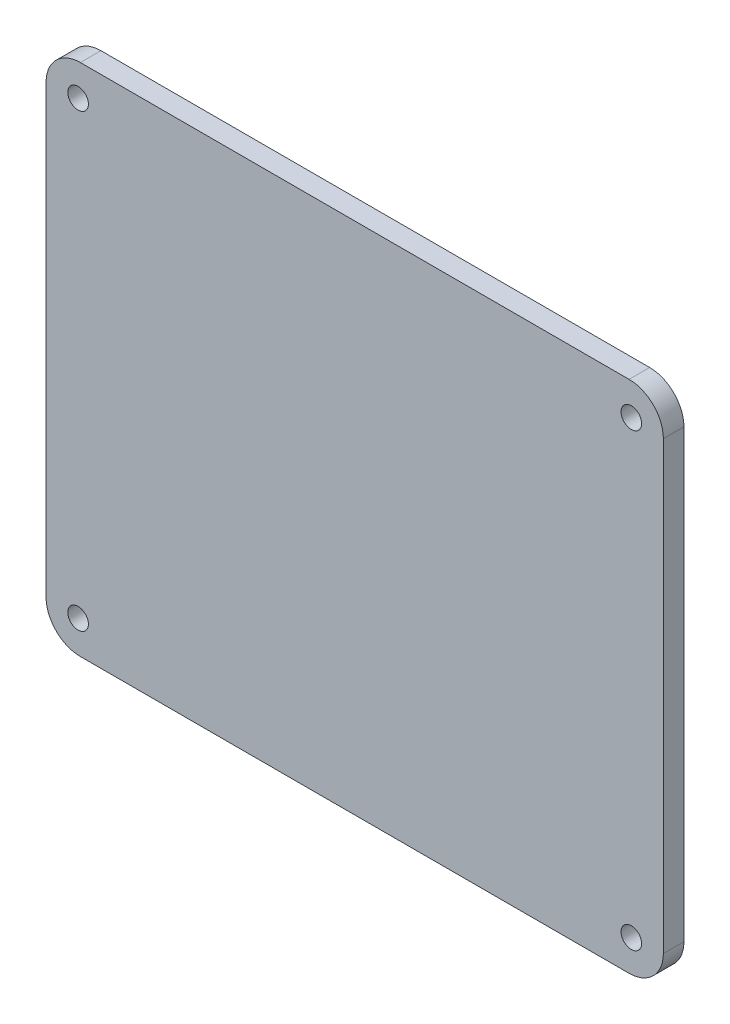
ISO-10303-21;
HEADER;
FILE_DESCRIPTION(('STEP AP214'),'2;1');
FILE_NAME('part.step','',(''),(''),'','','');
FILE_SCHEMA(('AUTOMOTIVE_DESIGN { 1 0 10303 214 1 1 1 1 }'));
ENDSEC;
DATA;
#1=APPLICATION_CONTEXT('core data for automotive mechanical design processes');
#2=APPLICATION_PROTOCOL_DEFINITION('international standard','automotive_design',2000,#1);
#3=PRODUCT_CONTEXT('',#1,'mechanical');
#4=PRODUCT('Part','Part','',(#3));
#5=PRODUCT_RELATED_PRODUCT_CATEGORY('part','',(#4));
#6=PRODUCT_DEFINITION_FORMATION('','',#4);
#7=PRODUCT_DEFINITION_CONTEXT('part definition',#1,'design');
#8=PRODUCT_DEFINITION('design','',#6,#7);
#9=PRODUCT_DEFINITION_SHAPE('','',#8);
#10=(LENGTH_UNIT() NAMED_UNIT(*) SI_UNIT(.MILLI.,.METRE.));
#11=(NAMED_UNIT(*) PLANE_ANGLE_UNIT() SI_UNIT($,.RADIAN.));
#12=(NAMED_UNIT(*) SI_UNIT($,.STERADIAN.) SOLID_ANGLE_UNIT());
#13=UNCERTAINTY_MEASURE_WITH_UNIT(LENGTH_MEASURE(1.E-05),#10,'distance_accuracy_value','');
#14=(GEOMETRIC_REPRESENTATION_CONTEXT(3) GLOBAL_UNCERTAINTY_ASSIGNED_CONTEXT((#13)) GLOBAL_UNIT_ASSIGNED_CONTEXT((#10,
#11,#12)) REPRESENTATION_CONTEXT('',''));
#15=CARTESIAN_POINT('',(0.,0.,0.));
#16=DIRECTION('',(0.,0.,1.));
#17=DIRECTION('',(1.,0.,0.));
#18=AXIS2_PLACEMENT_3D('',#15,#16,#17);
#19=CARTESIAN_POINT('',(-40.,-32.5,3.));
#20=DIRECTION('',(0.,0.,-1.));
#21=DIRECTION('',(-1.,0.,0.));
#22=AXIS2_PLACEMENT_3D('',#19,#20,#21);
#23=CYLINDRICAL_SURFACE('',#22,4.99999999999999);
#24=CARTESIAN_POINT('',(-40.,-32.5,0.));
#25=DIRECTION('',(0.,0.,1.));
#26=DIRECTION('',(1.,0.,0.));
#27=AXIS2_PLACEMENT_3D('',#24,#25,#26);
#28=CIRCLE('',#27,4.99999999999999);
#29=CARTESIAN_POINT('',(-45.,-32.5,0.));
#30=VERTEX_POINT('',#29);
#31=CARTESIAN_POINT('',(-40.,-37.5,0.));
#32=VERTEX_POINT('',#31);
#33=EDGE_CURVE('E133',#30,#32,#28,.T.);
#34=ORIENTED_EDGE('',*,*,#33,.T.);
#35=DIRECTION('',(0.,0.,-1.));
#36=VECTOR('',#35,1.);
#37=CARTESIAN_POINT('',(-40.,-37.5,3.));
#38=LINE('',#37,#36);
#39=CARTESIAN_POINT('',(-40.,-37.5,3.));
#40=VERTEX_POINT('',#39);
#41=EDGE_CURVE('E11',#40,#32,#38,.T.);
#42=ORIENTED_EDGE('',*,*,#41,.F.);
#43=CARTESIAN_POINT('',(-40.,-32.5,3.));
#44=DIRECTION('',(0.,0.,1.));
#45=DIRECTION('',(1.,0.,0.));
#46=AXIS2_PLACEMENT_3D('',#43,#44,#45);
#47=CIRCLE('',#46,4.99999999999999);
#48=CARTESIAN_POINT('',(-45.,-32.5,3.));
#49=VERTEX_POINT('',#48);
#50=EDGE_CURVE('E148',#49,#40,#47,.T.);
#51=ORIENTED_EDGE('',*,*,#50,.F.);
#52=DIRECTION('',(0.,0.,-1.));
#53=VECTOR('',#52,1.);
#54=CARTESIAN_POINT('',(-45.,-32.5,3.));
#55=LINE('',#54,#53);
#56=EDGE_CURVE('E129',#49,#30,#55,.T.);
#57=ORIENTED_EDGE('',*,*,#56,.T.);
#58=EDGE_LOOP('',(#34,#42,#51,#57));
#59=FACE_BOUND('',#58,.T.);
#60=ADVANCED_FACE('F35',(#59),#23,.T.);
#61=CARTESIAN_POINT('',(-40.,-37.5,3.));
#62=DIRECTION('',(0.,1.,0.));
#63=DIRECTION('',(0.,0.,1.));
#64=AXIS2_PLACEMENT_3D('',#61,#62,#63);
#65=PLANE('',#64);
#66=DIRECTION('',(1.,0.,0.));
#67=VECTOR('',#66,1.);
#68=CARTESIAN_POINT('',(-40.,-37.5,0.));
#69=LINE('',#68,#67);
#70=CARTESIAN_POINT('',(40.,-37.5,0.));
#71=VERTEX_POINT('',#70);
#72=EDGE_CURVE('E136',#32,#71,#69,.T.);
#73=ORIENTED_EDGE('',*,*,#72,.T.);
#74=DIRECTION('',(0.,0.,-1.));
#75=VECTOR('',#74,1.);
#76=CARTESIAN_POINT('',(40.,-37.5,3.));
#77=LINE('',#76,#75);
#78=CARTESIAN_POINT('',(40.,-37.5,3.));
#79=VERTEX_POINT('',#78);
#80=EDGE_CURVE('E44',#79,#71,#77,.T.);
#81=ORIENTED_EDGE('',*,*,#80,.F.);
#82=DIRECTION('',(1.,0.,0.));
#83=VECTOR('',#82,1.);
#84=CARTESIAN_POINT('',(-40.,-37.5,3.));
#85=LINE('',#84,#83);
#86=EDGE_CURVE('E96',#40,#79,#85,.T.);
#87=ORIENTED_EDGE('',*,*,#86,.F.);
#88=ORIENTED_EDGE('',*,*,#41,.T.);
#89=EDGE_LOOP('',(#73,#81,#87,#88));
#90=FACE_BOUND('',#89,.T.);
#91=ADVANCED_FACE('F215',(#90),#65,.F.);
#92=CARTESIAN_POINT('',(40.,-32.5,3.));
#93=DIRECTION('',(0.,0.,-1.));
#94=DIRECTION('',(-1.,0.,0.));
#95=AXIS2_PLACEMENT_3D('',#92,#93,#94);
#96=CYLINDRICAL_SURFACE('',#95,4.99999999999999);
#97=CARTESIAN_POINT('',(40.,-32.5,0.));
#98=DIRECTION('',(0.,0.,1.));
#99=DIRECTION('',(1.,0.,0.));
#100=AXIS2_PLACEMENT_3D('',#97,#98,#99);
#101=CIRCLE('',#100,4.99999999999999);
#102=CARTESIAN_POINT('',(45.,-32.5,0.));
#103=VERTEX_POINT('',#102);
#104=EDGE_CURVE('E139',#71,#103,#101,.T.);
#105=ORIENTED_EDGE('',*,*,#104,.T.);
#106=DIRECTION('',(0.,0.,-1.));
#107=VECTOR('',#106,1.);
#108=CARTESIAN_POINT('',(45.,-32.5,3.));
#109=LINE('',#108,#107);
#110=CARTESIAN_POINT('',(45.,-32.5,3.));
#111=VERTEX_POINT('',#110);
#112=EDGE_CURVE('E155',#111,#103,#109,.T.);
#113=ORIENTED_EDGE('',*,*,#112,.F.);
#114=CARTESIAN_POINT('',(40.,-32.5,3.));
#115=DIRECTION('',(0.,0.,1.));
#116=DIRECTION('',(1.,0.,0.));
#117=AXIS2_PLACEMENT_3D('',#114,#115,#116);
#118=CIRCLE('',#117,4.99999999999999);
#119=EDGE_CURVE('E183',#79,#111,#118,.T.);
#120=ORIENTED_EDGE('',*,*,#119,.F.);
#121=ORIENTED_EDGE('',*,*,#80,.T.);
#122=EDGE_LOOP('',(#105,#113,#120,#121));
#123=FACE_BOUND('',#122,.T.);
#124=ADVANCED_FACE('F219',(#123),#96,.T.);
#125=CARTESIAN_POINT('',(45.,32.5,3.));
#126=DIRECTION('',(-1.,0.,0.));
#127=DIRECTION('',(0.,0.,1.));
#128=AXIS2_PLACEMENT_3D('',#125,#126,#127);
#129=PLANE('',#128);
#130=DIRECTION('',(0.,1.,0.));
#131=VECTOR('',#130,1.);
#132=CARTESIAN_POINT('',(45.,32.5,0.));
#133=LINE('',#132,#131);
#134=CARTESIAN_POINT('',(45.,32.5,0.));
#135=VERTEX_POINT('',#134);
#136=EDGE_CURVE('E141',#103,#135,#133,.T.);
#137=ORIENTED_EDGE('',*,*,#136,.T.);
#138=DIRECTION('',(0.,0.,-1.));
#139=VECTOR('',#138,1.);
#140=CARTESIAN_POINT('',(45.,32.5,3.));
#141=LINE('',#140,#139);
#142=CARTESIAN_POINT('',(45.,32.5,3.));
#143=VERTEX_POINT('',#142);
#144=EDGE_CURVE('E152',#143,#135,#141,.T.);
#145=ORIENTED_EDGE('',*,*,#144,.F.);
#146=DIRECTION('',(0.,1.,0.));
#147=VECTOR('',#146,1.);
#148=CARTESIAN_POINT('',(45.,32.5,3.));
#149=LINE('',#148,#147);
#150=EDGE_CURVE('E185',#111,#143,#149,.T.);
#151=ORIENTED_EDGE('',*,*,#150,.F.);
#152=ORIENTED_EDGE('',*,*,#112,.T.);
#153=EDGE_LOOP('',(#137,#145,#151,#152));
#154=FACE_BOUND('',#153,.T.);
#155=ADVANCED_FACE('F191',(#154),#129,.F.);
#156=CARTESIAN_POINT('',(40.,32.5,3.));
#157=DIRECTION('',(0.,0.,-1.));
#158=DIRECTION('',(-1.,0.,0.));
#159=AXIS2_PLACEMENT_3D('',#156,#157,#158);
#160=CYLINDRICAL_SURFACE('',#159,4.99999999999999);
#161=CARTESIAN_POINT('',(40.,32.5,0.));
#162=DIRECTION('',(0.,0.,1.));
#163=DIRECTION('',(-1.,0.,0.));
#164=AXIS2_PLACEMENT_3D('',#161,#162,#163);
#165=CIRCLE('',#164,4.99999999999999);
#166=CARTESIAN_POINT('',(40.,37.5,0.));
#167=VERTEX_POINT('',#166);
#168=EDGE_CURVE('E143',#135,#167,#165,.T.);
#169=ORIENTED_EDGE('',*,*,#168,.T.);
#170=DIRECTION('',(0.,0.,-1.));
#171=VECTOR('',#170,1.);
#172=CARTESIAN_POINT('',(40.,37.5,3.));
#173=LINE('',#172,#171);
#174=CARTESIAN_POINT('',(40.,37.5,3.));
#175=VERTEX_POINT('',#174);
#176=EDGE_CURVE('E124',#175,#167,#173,.T.);
#177=ORIENTED_EDGE('',*,*,#176,.F.);
#178=CARTESIAN_POINT('',(40.,32.5,3.));
#179=DIRECTION('',(0.,0.,1.));
#180=DIRECTION('',(-1.,0.,0.));
#181=AXIS2_PLACEMENT_3D('',#178,#179,#180);
#182=CIRCLE('',#181,4.99999999999999);
#183=EDGE_CURVE('E115',#143,#175,#182,.T.);
#184=ORIENTED_EDGE('',*,*,#183,.F.);
#185=ORIENTED_EDGE('',*,*,#144,.T.);
#186=EDGE_LOOP('',(#169,#177,#184,#185));
#187=FACE_BOUND('',#186,.T.);
#188=ADVANCED_FACE('F195',(#187),#160,.T.);
#189=CARTESIAN_POINT('',(-40.,37.5,3.));
#190=DIRECTION('',(0.,-1.,0.));
#191=DIRECTION('',(0.,0.,-1.));
#192=AXIS2_PLACEMENT_3D('',#189,#190,#191);
#193=PLANE('',#192);
#194=DIRECTION('',(-1.,0.,0.));
#195=VECTOR('',#194,1.);
#196=CARTESIAN_POINT('',(-40.,37.5,0.));
#197=LINE('',#196,#195);
#198=CARTESIAN_POINT('',(-40.,37.5,0.));
#199=VERTEX_POINT('',#198);
#200=EDGE_CURVE('E123',#167,#199,#197,.T.);
#201=ORIENTED_EDGE('',*,*,#200,.T.);
#202=DIRECTION('',(0.,0.,-1.));
#203=VECTOR('',#202,1.);
#204=CARTESIAN_POINT('',(-40.,37.5,3.));
#205=LINE('',#204,#203);
#206=CARTESIAN_POINT('',(-40.,37.5,3.));
#207=VERTEX_POINT('',#206);
#208=EDGE_CURVE('E120',#207,#199,#205,.T.);
#209=ORIENTED_EDGE('',*,*,#208,.F.);
#210=DIRECTION('',(-1.,0.,0.));
#211=VECTOR('',#210,1.);
#212=CARTESIAN_POINT('',(-40.,37.5,3.));
#213=LINE('',#212,#211);
#214=EDGE_CURVE('E109',#175,#207,#213,.T.);
#215=ORIENTED_EDGE('',*,*,#214,.F.);
#216=ORIENTED_EDGE('',*,*,#176,.T.);
#217=EDGE_LOOP('',(#201,#209,#215,#216));
#218=FACE_BOUND('',#217,.T.);
#219=ADVANCED_FACE('F121',(#218),#193,.F.);
#220=CARTESIAN_POINT('',(-40.,32.5,3.));
#221=DIRECTION('',(0.,0.,-1.));
#222=DIRECTION('',(-1.,0.,0.));
#223=AXIS2_PLACEMENT_3D('',#220,#221,#222);
#224=CYLINDRICAL_SURFACE('',#223,4.99999999999999);
#225=CARTESIAN_POINT('',(-40.,32.5,0.));
#226=DIRECTION('',(0.,0.,1.));
#227=DIRECTION('',(1.,0.,0.));
#228=AXIS2_PLACEMENT_3D('',#225,#226,#227);
#229=CIRCLE('',#228,4.99999999999999);
#230=CARTESIAN_POINT('',(-45.,32.5,0.));
#231=VERTEX_POINT('',#230);
#232=EDGE_CURVE('E82',#199,#231,#229,.T.);
#233=ORIENTED_EDGE('',*,*,#232,.T.);
#234=DIRECTION('',(0.,0.,-1.));
#235=VECTOR('',#234,1.);
#236=CARTESIAN_POINT('',(-45.,32.5,3.));
#237=LINE('',#236,#235);
#238=CARTESIAN_POINT('',(-45.,32.5,3.));
#239=VERTEX_POINT('',#238);
#240=EDGE_CURVE('E125',#239,#231,#237,.T.);
#241=ORIENTED_EDGE('',*,*,#240,.F.);
#242=CARTESIAN_POINT('',(-40.,32.5,3.));
#243=DIRECTION('',(0.,0.,1.));
#244=DIRECTION('',(1.,0.,0.));
#245=AXIS2_PLACEMENT_3D('',#242,#243,#244);
#246=CIRCLE('',#245,4.99999999999999);
#247=EDGE_CURVE('E113',#207,#239,#246,.T.);
#248=ORIENTED_EDGE('',*,*,#247,.F.);
#249=ORIENTED_EDGE('',*,*,#208,.T.);
#250=EDGE_LOOP('',(#233,#241,#248,#249));
#251=FACE_BOUND('',#250,.T.);
#252=ADVANCED_FACE('F127',(#251),#224,.T.);
#253=CARTESIAN_POINT('',(-45.,32.5,3.));
#254=DIRECTION('',(1.,0.,0.));
#255=DIRECTION('',(0.,0.,-1.));
#256=AXIS2_PLACEMENT_3D('',#253,#254,#255);
#257=PLANE('',#256);
#258=DIRECTION('',(0.,-1.,0.));
#259=VECTOR('',#258,1.);
#260=CARTESIAN_POINT('',(-45.,32.5,0.));
#261=LINE('',#260,#259);
#262=EDGE_CURVE('E88',#231,#30,#261,.T.);
#263=ORIENTED_EDGE('',*,*,#262,.T.);
#264=ORIENTED_EDGE('',*,*,#56,.F.);
#265=DIRECTION('',(0.,-1.,0.));
#266=VECTOR('',#265,1.);
#267=CARTESIAN_POINT('',(-45.,32.5,3.));
#268=LINE('',#267,#266);
#269=EDGE_CURVE('E53',#239,#49,#268,.T.);
#270=ORIENTED_EDGE('',*,*,#269,.F.);
#271=ORIENTED_EDGE('',*,*,#240,.T.);
#272=EDGE_LOOP('',(#263,#264,#270,#271));
#273=FACE_BOUND('',#272,.T.);
#274=ADVANCED_FACE('F203',(#273),#257,.F.);
#275=CARTESIAN_POINT('',(-40.,-32.5,3.));
#276=DIRECTION('',(0.,0.,1.));
#277=DIRECTION('',(1.,0.,0.));
#278=AXIS2_PLACEMENT_3D('',#275,#276,#277);
#279=PLANE('',#278);
#280=CARTESIAN_POINT('',(-40.3284271247462,32.8284271247462,3.));
#281=DIRECTION('',(0.,0.,1.));
#282=DIRECTION('',(1.,0.,0.));
#283=AXIS2_PLACEMENT_3D('',#280,#281,#282);
#284=CIRCLE('',#283,1.5);
#285=CARTESIAN_POINT('',(-38.8284271247462,32.8284271247462,3.));
#286=VERTEX_POINT('',#285);
#287=EDGE_CURVE('E166',#286,#286,#284,.T.);
#288=ORIENTED_EDGE('',*,*,#287,.F.);
#289=EDGE_LOOP('',(#288));
#290=FACE_BOUND('',#289,.T.);
#291=CARTESIAN_POINT('',(-40.3284271247462,-32.8284271247462,3.));
#292=DIRECTION('',(0.,0.,1.));
#293=DIRECTION('',(1.,0.,0.));
#294=AXIS2_PLACEMENT_3D('',#291,#292,#293);
#295=CIRCLE('',#294,1.5);
#296=CARTESIAN_POINT('',(-38.8284271247462,-32.8284271247462,3.));
#297=VERTEX_POINT('',#296);
#298=EDGE_CURVE('E302',#297,#297,#295,.T.);
#299=ORIENTED_EDGE('',*,*,#298,.F.);
#300=EDGE_LOOP('',(#299));
#301=FACE_BOUND('',#300,.T.);
#302=CARTESIAN_POINT('',(40.3284271247462,-32.8284271247462,3.));
#303=DIRECTION('',(0.,0.,1.));
#304=DIRECTION('',(1.,0.,0.));
#305=AXIS2_PLACEMENT_3D('',#302,#303,#304);
#306=CIRCLE('',#305,1.5);
#307=CARTESIAN_POINT('',(41.8284271247462,-32.8284271247462,3.));
#308=VERTEX_POINT('',#307);
#309=EDGE_CURVE('E179',#308,#308,#306,.T.);
#310=ORIENTED_EDGE('',*,*,#309,.F.);
#311=EDGE_LOOP('',(#310));
#312=FACE_BOUND('',#311,.T.);
#313=CARTESIAN_POINT('',(40.3284271247462,32.8284271247462,3.));
#314=DIRECTION('',(0.,0.,1.));
#315=DIRECTION('',(1.,0.,0.));
#316=AXIS2_PLACEMENT_3D('',#313,#314,#315);
#317=CIRCLE('',#316,1.5);
#318=CARTESIAN_POINT('',(41.8284271247462,32.8284271247462,3.));
#319=VERTEX_POINT('',#318);
#320=EDGE_CURVE('E162',#319,#319,#317,.T.);
#321=ORIENTED_EDGE('',*,*,#320,.F.);
#322=EDGE_LOOP('',(#321));
#323=FACE_BOUND('',#322,.T.);
#324=ORIENTED_EDGE('',*,*,#50,.T.);
#325=ORIENTED_EDGE('',*,*,#86,.T.);
#326=ORIENTED_EDGE('',*,*,#119,.T.);
#327=ORIENTED_EDGE('',*,*,#150,.T.);
#328=ORIENTED_EDGE('',*,*,#183,.T.);
#329=ORIENTED_EDGE('',*,*,#214,.T.);
#330=ORIENTED_EDGE('',*,*,#247,.T.);
#331=ORIENTED_EDGE('',*,*,#269,.T.);
#332=EDGE_LOOP('',(#324,#325,#326,#327,#328,#329,#330,#331));
#333=FACE_BOUND('',#332,.T.);
#334=ADVANCED_FACE('F111',(#290,#301,#312,#323,#333),#279,.T.);
#335=CARTESIAN_POINT('',(-40.,-32.5,0.));
#336=DIRECTION('',(0.,0.,1.));
#337=DIRECTION('',(1.,0.,0.));
#338=AXIS2_PLACEMENT_3D('',#335,#336,#337);
#339=PLANE('',#338);
#340=CARTESIAN_POINT('',(-40.3284271247462,32.8284271247462,0.));
#341=DIRECTION('',(0.,0.,1.));
#342=DIRECTION('',(1.,0.,0.));
#343=AXIS2_PLACEMENT_3D('',#340,#341,#342);
#344=CIRCLE('',#343,1.5);
#345=CARTESIAN_POINT('',(-38.8284271247462,32.8284271247462,0.));
#346=VERTEX_POINT('',#345);
#347=EDGE_CURVE('E38',#346,#346,#344,.T.);
#348=ORIENTED_EDGE('',*,*,#347,.T.);
#349=EDGE_LOOP('',(#348));
#350=FACE_BOUND('',#349,.T.);
#351=CARTESIAN_POINT('',(-40.3284271247462,-32.8284271247462,0.));
#352=DIRECTION('',(0.,0.,1.));
#353=DIRECTION('',(1.,0.,0.));
#354=AXIS2_PLACEMENT_3D('',#351,#352,#353);
#355=CIRCLE('',#354,1.5);
#356=CARTESIAN_POINT('',(-38.8284271247462,-32.8284271247462,0.));
#357=VERTEX_POINT('',#356);
#358=EDGE_CURVE('E165',#357,#357,#355,.T.);
#359=ORIENTED_EDGE('',*,*,#358,.T.);
#360=EDGE_LOOP('',(#359));
#361=FACE_BOUND('',#360,.T.);
#362=CARTESIAN_POINT('',(40.3284271247462,-32.8284271247462,0.));
#363=DIRECTION('',(0.,0.,1.));
#364=DIRECTION('',(1.,0.,0.));
#365=AXIS2_PLACEMENT_3D('',#362,#363,#364);
#366=CIRCLE('',#365,1.5);
#367=CARTESIAN_POINT('',(41.8284271247462,-32.8284271247462,0.));
#368=VERTEX_POINT('',#367);
#369=EDGE_CURVE('E163',#368,#368,#366,.T.);
#370=ORIENTED_EDGE('',*,*,#369,.T.);
#371=EDGE_LOOP('',(#370));
#372=FACE_BOUND('',#371,.T.);
#373=CARTESIAN_POINT('',(40.3284271247462,32.8284271247462,0.));
#374=DIRECTION('',(0.,0.,1.));
#375=DIRECTION('',(1.,0.,0.));
#376=AXIS2_PLACEMENT_3D('',#373,#374,#375);
#377=CIRCLE('',#376,1.5);
#378=CARTESIAN_POINT('',(41.8284271247462,32.8284271247462,0.));
#379=VERTEX_POINT('',#378);
#380=EDGE_CURVE('E137',#379,#379,#377,.T.);
#381=ORIENTED_EDGE('',*,*,#380,.T.);
#382=EDGE_LOOP('',(#381));
#383=FACE_BOUND('',#382,.T.);
#384=ORIENTED_EDGE('',*,*,#33,.F.);
#385=ORIENTED_EDGE('',*,*,#262,.F.);
#386=ORIENTED_EDGE('',*,*,#232,.F.);
#387=ORIENTED_EDGE('',*,*,#200,.F.);
#388=ORIENTED_EDGE('',*,*,#168,.F.);
#389=ORIENTED_EDGE('',*,*,#136,.F.);
#390=ORIENTED_EDGE('',*,*,#104,.F.);
#391=ORIENTED_EDGE('',*,*,#72,.F.);
#392=EDGE_LOOP('',(#384,#385,#386,#387,#388,#389,#390,#391));
#393=FACE_BOUND('',#392,.T.);
#394=ADVANCED_FACE('F198',(#350,#361,#372,#383,#393),#339,.F.);
#395=CARTESIAN_POINT('',(40.3284271247462,32.8284271247462,-7.));
#396=DIRECTION('',(0.,0.,1.));
#397=DIRECTION('',(1.,0.,0.));
#398=AXIS2_PLACEMENT_3D('',#395,#396,#397);
#399=CYLINDRICAL_SURFACE('',#398,1.5);
#400=ORIENTED_EDGE('',*,*,#320,.T.);
#401=EDGE_LOOP('',(#400));
#402=FACE_BOUND('',#401,.T.);
#403=ORIENTED_EDGE('',*,*,#380,.F.);
#404=EDGE_LOOP('',(#403));
#405=FACE_BOUND('',#404,.T.);
#406=ADVANCED_FACE('F258',(#402,#405),#399,.F.);
#407=CARTESIAN_POINT('',(40.3284271247462,-32.8284271247462,-7.));
#408=DIRECTION('',(0.,0.,1.));
#409=DIRECTION('',(1.,0.,0.));
#410=AXIS2_PLACEMENT_3D('',#407,#408,#409);
#411=CYLINDRICAL_SURFACE('',#410,1.5);
#412=ORIENTED_EDGE('',*,*,#309,.T.);
#413=EDGE_LOOP('',(#412));
#414=FACE_BOUND('',#413,.T.);
#415=ORIENTED_EDGE('',*,*,#369,.F.);
#416=EDGE_LOOP('',(#415));
#417=FACE_BOUND('',#416,.T.);
#418=ADVANCED_FACE('F266',(#414,#417),#411,.F.);
#419=CARTESIAN_POINT('',(-40.3284271247462,-32.8284271247462,-7.));
#420=DIRECTION('',(0.,0.,1.));
#421=DIRECTION('',(1.,0.,0.));
#422=AXIS2_PLACEMENT_3D('',#419,#420,#421);
#423=CYLINDRICAL_SURFACE('',#422,1.5);
#424=ORIENTED_EDGE('',*,*,#298,.T.);
#425=EDGE_LOOP('',(#424));
#426=FACE_BOUND('',#425,.T.);
#427=ORIENTED_EDGE('',*,*,#358,.F.);
#428=EDGE_LOOP('',(#427));
#429=FACE_BOUND('',#428,.T.);
#430=ADVANCED_FACE('F275',(#426,#429),#423,.F.);
#431=CARTESIAN_POINT('',(-40.3284271247462,32.8284271247462,-7.));
#432=DIRECTION('',(0.,0.,1.));
#433=DIRECTION('',(1.,0.,0.));
#434=AXIS2_PLACEMENT_3D('',#431,#432,#433);
#435=CYLINDRICAL_SURFACE('',#434,1.5);
#436=ORIENTED_EDGE('',*,*,#287,.T.);
#437=EDGE_LOOP('',(#436));
#438=FACE_BOUND('',#437,.T.);
#439=ORIENTED_EDGE('',*,*,#347,.F.);
#440=EDGE_LOOP('',(#439));
#441=FACE_BOUND('',#440,.T.);
#442=ADVANCED_FACE('F285',(#438,#441),#435,.F.);
#443=CLOSED_SHELL('',(#60,#91,#124,#155,#188,#219,#252,#274,#334,#394,#406,#418,#430,#442));
#444=MANIFOLD_SOLID_BREP('B2',#443);
#445=ADVANCED_BREP_SHAPE_REPRESENTATION('',(#18,#444),#14);
#446=SHAPE_DEFINITION_REPRESENTATION(#9,#445);
ENDSEC;
END-ISO-10303-21;
